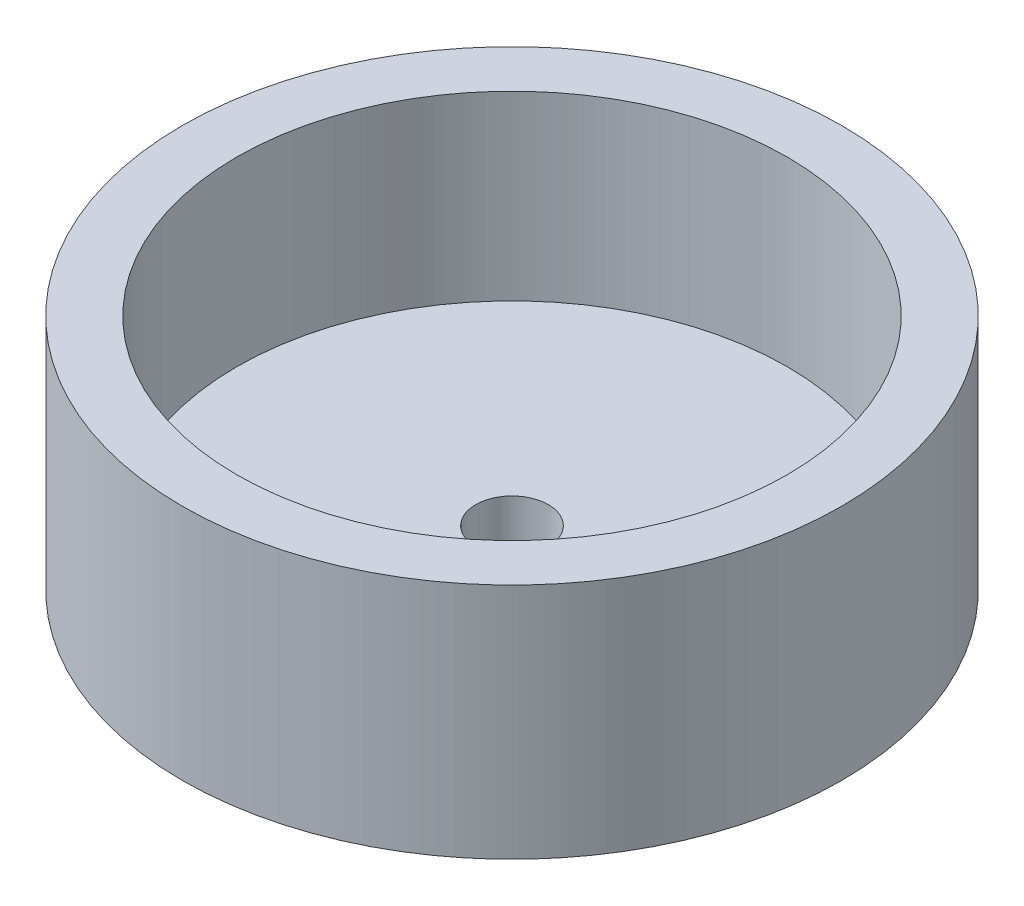
ISO-10303-21;
HEADER;
FILE_DESCRIPTION(('STEP AP214'),'2;1');
FILE_NAME('part.step','',(''),(''),'','','');
FILE_SCHEMA(('AUTOMOTIVE_DESIGN { 1 0 10303 214 1 1 1 1 }'));
ENDSEC;
DATA;
#1=APPLICATION_CONTEXT('core data for automotive mechanical design processes');
#2=APPLICATION_PROTOCOL_DEFINITION('international standard','automotive_design',2000,#1);
#3=PRODUCT_CONTEXT('',#1,'mechanical');
#4=PRODUCT('Part','Part','',(#3));
#5=PRODUCT_RELATED_PRODUCT_CATEGORY('part','',(#4));
#6=PRODUCT_DEFINITION_FORMATION('','',#4);
#7=PRODUCT_DEFINITION_CONTEXT('part definition',#1,'design');
#8=PRODUCT_DEFINITION('design','',#6,#7);
#9=PRODUCT_DEFINITION_SHAPE('','',#8);
#10=(LENGTH_UNIT() NAMED_UNIT(*) SI_UNIT(.MILLI.,.METRE.));
#11=(NAMED_UNIT(*) PLANE_ANGLE_UNIT() SI_UNIT($,.RADIAN.));
#12=(NAMED_UNIT(*) SI_UNIT($,.STERADIAN.) SOLID_ANGLE_UNIT());
#13=UNCERTAINTY_MEASURE_WITH_UNIT(LENGTH_MEASURE(1.E-05),#10,'distance_accuracy_value','');
#14=(GEOMETRIC_REPRESENTATION_CONTEXT(3) GLOBAL_UNCERTAINTY_ASSIGNED_CONTEXT((#13)) GLOBAL_UNIT_ASSIGNED_CONTEXT((#10,
#11,#12)) REPRESENTATION_CONTEXT('',''));
#15=CARTESIAN_POINT('',(0.,0.,0.));
#16=DIRECTION('',(0.,0.,1.));
#17=DIRECTION('',(1.,0.,0.));
#18=AXIS2_PLACEMENT_3D('',#15,#16,#17);
#19=CARTESIAN_POINT('',(0.,4.,0.));
#20=DIRECTION('',(0.,-1.,0.));
#21=DIRECTION('',(0.,0.,-1.));
#22=AXIS2_PLACEMENT_3D('',#19,#20,#21);
#23=CYLINDRICAL_SURFACE('',#22,23.6);
#24=CARTESIAN_POINT('',(0.,0.,0.));
#25=DIRECTION('',(0.,1.,0.));
#26=DIRECTION('',(0.,0.,1.));
#27=AXIS2_PLACEMENT_3D('',#24,#25,#26);
#28=CIRCLE('',#27,23.6);
#29=CARTESIAN_POINT('',(0.,0.,23.6));
#30=VERTEX_POINT('',#29);
#31=EDGE_CURVE('E55',#30,#30,#28,.T.);
#32=ORIENTED_EDGE('',*,*,#31,.T.);
#33=EDGE_LOOP('',(#32));
#34=FACE_BOUND('',#33,.T.);
#35=CARTESIAN_POINT('',(0.,17.,0.));
#36=DIRECTION('',(0.,1.,0.));
#37=DIRECTION('',(0.,0.,1.));
#38=AXIS2_PLACEMENT_3D('',#35,#36,#37);
#39=CIRCLE('',#38,23.6);
#40=CARTESIAN_POINT('',(0.,17.,23.6));
#41=VERTEX_POINT('',#40);
#42=EDGE_CURVE('E58',#41,#41,#39,.T.);
#43=ORIENTED_EDGE('',*,*,#42,.F.);
#44=EDGE_LOOP('',(#43));
#45=FACE_BOUND('',#44,.T.);
#46=ADVANCED_FACE('F37',(#34,#45),#23,.T.);
#47=CARTESIAN_POINT('',(0.,4.,0.));
#48=DIRECTION('',(0.,-1.,0.));
#49=DIRECTION('',(0.,0.,-1.));
#50=AXIS2_PLACEMENT_3D('',#47,#48,#49);
#51=CYLINDRICAL_SURFACE('',#50,2.6);
#52=CARTESIAN_POINT('',(0.,4.,0.));
#53=DIRECTION('',(0.,1.,0.));
#54=DIRECTION('',(0.,0.,1.));
#55=AXIS2_PLACEMENT_3D('',#52,#53,#54);
#56=CIRCLE('',#55,2.6);
#57=CARTESIAN_POINT('',(0.,4.,2.6));
#58=VERTEX_POINT('',#57);
#59=EDGE_CURVE('E44',#58,#58,#56,.T.);
#60=ORIENTED_EDGE('',*,*,#59,.T.);
#61=EDGE_LOOP('',(#60));
#62=FACE_BOUND('',#61,.T.);
#63=CARTESIAN_POINT('',(0.,0.,0.));
#64=DIRECTION('',(0.,1.,0.));
#65=DIRECTION('',(0.,0.,1.));
#66=AXIS2_PLACEMENT_3D('',#63,#64,#65);
#67=CIRCLE('',#66,2.6);
#68=CARTESIAN_POINT('',(0.,0.,2.6));
#69=VERTEX_POINT('',#68);
#70=EDGE_CURVE('E49',#69,#69,#67,.T.);
#71=ORIENTED_EDGE('',*,*,#70,.F.);
#72=EDGE_LOOP('',(#71));
#73=FACE_BOUND('',#72,.T.);
#74=ADVANCED_FACE('F84',(#62,#73),#51,.F.);
#75=CARTESIAN_POINT('',(0.,4.,0.));
#76=DIRECTION('',(0.,1.,0.));
#77=DIRECTION('',(0.,0.,1.));
#78=AXIS2_PLACEMENT_3D('',#75,#76,#77);
#79=PLANE('',#78);
#80=CARTESIAN_POINT('',(0.,4.,0.));
#81=DIRECTION('',(0.,1.,0.));
#82=DIRECTION('',(0.,0.,1.));
#83=AXIS2_PLACEMENT_3D('',#80,#81,#82);
#84=CIRCLE('',#83,19.7);
#85=CARTESIAN_POINT('',(0.,4.,-19.7));
#86=VERTEX_POINT('',#85);
#87=EDGE_CURVE('E10',#86,#86,#84,.F.);
#88=ORIENTED_EDGE('',*,*,#87,.F.);
#89=EDGE_LOOP('',(#88));
#90=FACE_BOUND('',#89,.T.);
#91=ORIENTED_EDGE('',*,*,#59,.F.);
#92=EDGE_LOOP('',(#91));
#93=FACE_BOUND('',#92,.T.);
#94=ADVANCED_FACE('F88',(#90,#93),#79,.T.);
#95=CARTESIAN_POINT('',(0.,0.,0.));
#96=DIRECTION('',(0.,1.,0.));
#97=DIRECTION('',(0.,0.,1.));
#98=AXIS2_PLACEMENT_3D('',#95,#96,#97);
#99=PLANE('',#98);
#100=ORIENTED_EDGE('',*,*,#31,.F.);
#101=EDGE_LOOP('',(#100));
#102=FACE_BOUND('',#101,.T.);
#103=ORIENTED_EDGE('',*,*,#70,.T.);
#104=EDGE_LOOP('',(#103));
#105=FACE_BOUND('',#104,.T.);
#106=ADVANCED_FACE('F81',(#102,#105),#99,.F.);
#107=CARTESIAN_POINT('',(0.,17.,0.));
#108=DIRECTION('',(0.,-1.,0.));
#109=DIRECTION('',(0.,0.,-1.));
#110=AXIS2_PLACEMENT_3D('',#107,#108,#109);
#111=CYLINDRICAL_SURFACE('',#110,19.7);
#112=CARTESIAN_POINT('',(0.,17.,0.));
#113=DIRECTION('',(0.,1.,0.));
#114=DIRECTION('',(0.,0.,1.));
#115=AXIS2_PLACEMENT_3D('',#112,#113,#114);
#116=CIRCLE('',#115,19.7);
#117=CARTESIAN_POINT('',(0.,17.,-19.7));
#118=VERTEX_POINT('',#117);
#119=EDGE_CURVE('E66',#118,#118,#116,.T.);
#120=CARTESIAN_POINT('',(0.,17.,-19.7));
#121=CARTESIAN_POINT('',(0.,16.8645833333333,-19.7));
#122=CARTESIAN_POINT('',(0.,16.7291666666667,-19.7));
#123=CARTESIAN_POINT('',(0.,16.4583333333333,-19.7));
#124=CARTESIAN_POINT('',(0.,16.3229166666667,-19.7));
#125=CARTESIAN_POINT('',(0.,16.0520833333333,-19.7));
#126=CARTESIAN_POINT('',(0.,15.9166666666667,-19.7));
#127=CARTESIAN_POINT('',(0.,15.6458333333333,-19.7));
#128=CARTESIAN_POINT('',(0.,15.5104166666667,-19.7));
#129=CARTESIAN_POINT('',(0.,15.2395833333333,-19.7));
#130=CARTESIAN_POINT('',(0.,15.1041666666667,-19.7));
#131=CARTESIAN_POINT('',(0.,14.8333333333333,-19.7));
#132=CARTESIAN_POINT('',(0.,14.6979166666667,-19.7));
#133=CARTESIAN_POINT('',(0.,14.4270833333333,-19.7));
#134=CARTESIAN_POINT('',(0.,14.2916666666667,-19.7));
#135=CARTESIAN_POINT('',(0.,14.0208333333333,-19.7));
#136=CARTESIAN_POINT('',(0.,13.8854166666667,-19.7));
#137=CARTESIAN_POINT('',(0.,13.6145833333333,-19.7));
#138=CARTESIAN_POINT('',(0.,13.4791666666667,-19.7));
#139=CARTESIAN_POINT('',(0.,13.2083333333333,-19.7));
#140=CARTESIAN_POINT('',(0.,13.0729166666667,-19.7));
#141=CARTESIAN_POINT('',(0.,12.8020833333333,-19.7));
#142=CARTESIAN_POINT('',(0.,12.6666666666667,-19.7));
#143=CARTESIAN_POINT('',(0.,12.3958333333333,-19.7));
#144=CARTESIAN_POINT('',(0.,12.2604166666667,-19.7));
#145=CARTESIAN_POINT('',(0.,11.9895833333333,-19.7));
#146=CARTESIAN_POINT('',(0.,11.8541666666667,-19.7));
#147=CARTESIAN_POINT('',(0.,11.5833333333333,-19.7));
#148=CARTESIAN_POINT('',(0.,11.4479166666667,-19.7));
#149=CARTESIAN_POINT('',(0.,11.1770833333333,-19.7));
#150=CARTESIAN_POINT('',(0.,11.0416666666667,-19.7));
#151=CARTESIAN_POINT('',(0.,10.7708333333333,-19.7));
#152=CARTESIAN_POINT('',(0.,10.6354166666667,-19.7));
#153=CARTESIAN_POINT('',(0.,10.3645833333333,-19.7));
#154=CARTESIAN_POINT('',(0.,10.2291666666667,-19.7));
#155=CARTESIAN_POINT('',(0.,9.95833333333333,-19.7));
#156=CARTESIAN_POINT('',(0.,9.82291666666667,-19.7));
#157=CARTESIAN_POINT('',(0.,9.55208333333333,-19.7));
#158=CARTESIAN_POINT('',(0.,9.41666666666667,-19.7));
#159=CARTESIAN_POINT('',(0.,9.14583333333333,-19.7));
#160=CARTESIAN_POINT('',(0.,9.01041666666666,-19.7));
#161=CARTESIAN_POINT('',(0.,8.73958333333333,-19.7));
#162=CARTESIAN_POINT('',(0.,8.60416666666667,-19.7));
#163=CARTESIAN_POINT('',(0.,8.33333333333333,-19.7));
#164=CARTESIAN_POINT('',(0.,8.19791666666667,-19.7));
#165=CARTESIAN_POINT('',(0.,7.92708333333333,-19.7));
#166=CARTESIAN_POINT('',(0.,7.79166666666667,-19.7));
#167=CARTESIAN_POINT('',(0.,7.52083333333333,-19.7));
#168=CARTESIAN_POINT('',(0.,7.38541666666667,-19.7));
#169=CARTESIAN_POINT('',(0.,7.11458333333333,-19.7));
#170=CARTESIAN_POINT('',(0.,6.97916666666667,-19.7));
#171=CARTESIAN_POINT('',(0.,6.70833333333333,-19.7));
#172=CARTESIAN_POINT('',(0.,6.57291666666667,-19.7));
#173=CARTESIAN_POINT('',(0.,6.30208333333333,-19.7));
#174=CARTESIAN_POINT('',(0.,6.16666666666667,-19.7));
#175=CARTESIAN_POINT('',(0.,5.89583333333333,-19.7));
#176=CARTESIAN_POINT('',(0.,5.76041666666666,-19.7));
#177=CARTESIAN_POINT('',(0.,5.48958333333333,-19.7));
#178=CARTESIAN_POINT('',(0.,5.35416666666667,-19.7));
#179=CARTESIAN_POINT('',(0.,5.08333333333333,-19.7));
#180=CARTESIAN_POINT('',(0.,4.94791666666667,-19.7));
#181=CARTESIAN_POINT('',(0.,4.67708333333333,-19.7));
#182=CARTESIAN_POINT('',(0.,4.54166666666667,-19.7));
#183=CARTESIAN_POINT('',(0.,4.27083333333333,-19.7));
#184=CARTESIAN_POINT('',(0.,4.13541666666667,-19.7));
#185=CARTESIAN_POINT('',(0.,4.,-19.7));
#186=B_SPLINE_CURVE_WITH_KNOTS('',3,(#120,#121,#122,#123,#124,#125,#126,#127,#128,#129,#130,
#131,#132,#133,#134,#135,#136,#137,#138,#139,#140,#141,#142,#143,#144,#145,#146,#147,#148,#149,
#150,#151,#152,#153,#154,#155,#156,#157,#158,#159,#160,#161,#162,#163,#164,#165,#166,#167,#168,
#169,#170,#171,#172,#173,#174,#175,#176,#177,#178,#179,#180,#181,#182,#183,#184,#185),
.UNSPECIFIED.,.F.,.F.,(4,2,2,2,2,2,2,2,2,2,2,2,2,2,2,2,2,2,2,2,2,2,2,2,2,2,2,2,2,2,2,2,4),(0.,
0.406249999999997,0.812499999999997,1.21875,1.625,2.03125,2.4375,2.84375,3.25,3.65625,4.0625,
4.46875,4.875,5.28125,5.6875,6.09375,6.5,6.90625,7.3125,7.71875,8.125,8.53125,8.9375,9.34375,
9.75,10.15625,10.5625,10.96875,11.375,11.78125,12.1875,12.59375,13.),.UNSPECIFIED.);
#187=EDGE_CURVE('BSEAM73',#118,#86,#186,.T.);
#188=ORIENTED_EDGE('',*,*,#119,.T.);
#189=ORIENTED_EDGE('',*,*,#87,.T.);
#190=ORIENTED_EDGE('',*,*,#187,.T.);
#191=ORIENTED_EDGE('',*,*,#187,.F.);
#192=EDGE_LOOP('',(#188,#190,#189,#191));
#193=FACE_BOUND('',#192,.T.);
#194=ADVANCED_FACE('F73',(#193),#111,.F.);
#195=CARTESIAN_POINT('',(0.,17.,0.));
#196=DIRECTION('',(0.,1.,0.));
#197=DIRECTION('',(0.,0.,1.));
#198=AXIS2_PLACEMENT_3D('',#195,#196,#197);
#199=PLANE('',#198);
#200=ORIENTED_EDGE('',*,*,#119,.F.);
#201=EDGE_LOOP('',(#200));
#202=FACE_BOUND('',#201,.T.);
#203=ORIENTED_EDGE('',*,*,#42,.T.);
#204=EDGE_LOOP('',(#203));
#205=FACE_BOUND('',#204,.T.);
#206=ADVANCED_FACE('F75',(#202,#205),#199,.T.);
#207=CLOSED_SHELL('',(#46,#74,#94,#106,#194,#206));
#208=MANIFOLD_SOLID_BREP('B2',#207);
#209=ADVANCED_BREP_SHAPE_REPRESENTATION('',(#18,#208),#14);
#210=SHAPE_DEFINITION_REPRESENTATION(#9,#209);
ENDSEC;
END-ISO-10303-21;
